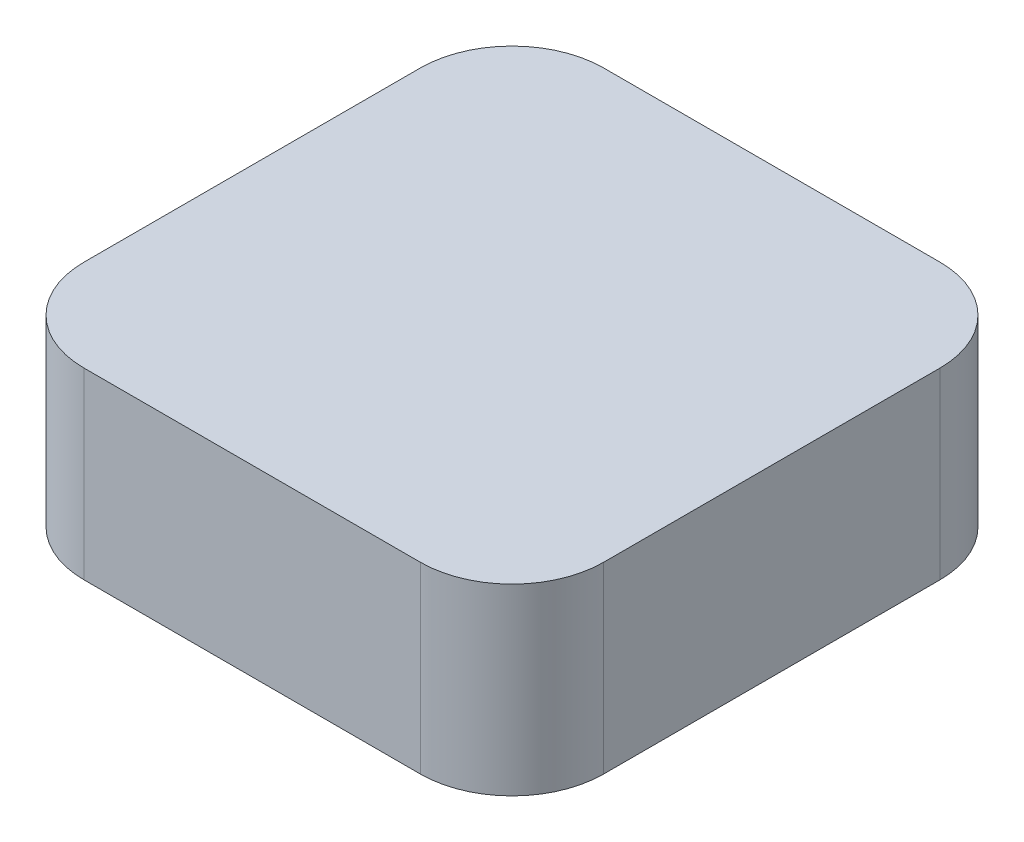
ISO-10303-21;
HEADER;
FILE_DESCRIPTION(('STEP AP214'),'2;1');
FILE_NAME('part.step','',(''),(''),'','','');
FILE_SCHEMA(('AUTOMOTIVE_DESIGN { 1 0 10303 214 1 1 1 1 }'));
ENDSEC;
DATA;
#1=APPLICATION_CONTEXT('core data for automotive mechanical design processes');
#2=APPLICATION_PROTOCOL_DEFINITION('international standard','automotive_design',2000,#1);
#3=PRODUCT_CONTEXT('',#1,'mechanical');
#4=PRODUCT('Part','Part','',(#3));
#5=PRODUCT_RELATED_PRODUCT_CATEGORY('part','',(#4));
#6=PRODUCT_DEFINITION_FORMATION('','',#4);
#7=PRODUCT_DEFINITION_CONTEXT('part definition',#1,'design');
#8=PRODUCT_DEFINITION('design','',#6,#7);
#9=PRODUCT_DEFINITION_SHAPE('','',#8);
#10=(LENGTH_UNIT() NAMED_UNIT(*) SI_UNIT(.MILLI.,.METRE.));
#11=(NAMED_UNIT(*) PLANE_ANGLE_UNIT() SI_UNIT($,.RADIAN.));
#12=(NAMED_UNIT(*) SI_UNIT($,.STERADIAN.) SOLID_ANGLE_UNIT());
#13=UNCERTAINTY_MEASURE_WITH_UNIT(LENGTH_MEASURE(1.E-05),#10,'distance_accuracy_value','');
#14=(GEOMETRIC_REPRESENTATION_CONTEXT(3) GLOBAL_UNCERTAINTY_ASSIGNED_CONTEXT((#13)) GLOBAL_UNIT_ASSIGNED_CONTEXT((#10,
#11,#12)) REPRESENTATION_CONTEXT('',''));
#15=CARTESIAN_POINT('',(0.,0.,0.));
#16=DIRECTION('',(0.,0.,1.));
#17=DIRECTION('',(1.,0.,0.));
#18=AXIS2_PLACEMENT_3D('',#15,#16,#17);
#19=CARTESIAN_POINT('',(-5.5,74.,-87.));
#20=DIRECTION('',(0.,-1.,0.));
#21=DIRECTION('',(0.,0.,-1.));
#22=AXIS2_PLACEMENT_3D('',#19,#20,#21);
#23=PLANE('',#22);
#24=CARTESIAN_POINT('',(-5.5,74.,-87.));
#25=DIRECTION('',(0.,1.,0.));
#26=DIRECTION('',(0.,0.,-1.));
#27=AXIS2_PLACEMENT_3D('',#24,#25,#26);
#28=CIRCLE('',#27,3.);
#29=CARTESIAN_POINT('',(-5.5,74.,-90.));
#30=VERTEX_POINT('',#29);
#31=CARTESIAN_POINT('',(-8.5,74.,-87.));
#32=VERTEX_POINT('',#31);
#33=EDGE_CURVE('E149',#30,#32,#28,.T.);
#34=ORIENTED_EDGE('',*,*,#33,.F.);
#35=DIRECTION('',(-1.,0.,0.));
#36=VECTOR('',#35,1.);
#37=CARTESIAN_POINT('',(-5.5,74.,-90.));
#38=LINE('',#37,#36);
#39=CARTESIAN_POINT('',(5.5,74.,-90.));
#40=VERTEX_POINT('',#39);
#41=EDGE_CURVE('E96',#40,#30,#38,.T.);
#42=ORIENTED_EDGE('',*,*,#41,.F.);
#43=CARTESIAN_POINT('',(5.5,74.,-87.));
#44=DIRECTION('',(0.,1.,0.));
#45=DIRECTION('',(0.,0.,-1.));
#46=AXIS2_PLACEMENT_3D('',#43,#44,#45);
#47=CIRCLE('',#46,3.);
#48=CARTESIAN_POINT('',(8.5,74.,-87.));
#49=VERTEX_POINT('',#48);
#50=EDGE_CURVE('E163',#49,#40,#47,.T.);
#51=ORIENTED_EDGE('',*,*,#50,.F.);
#52=DIRECTION('',(0.,0.,-1.));
#53=VECTOR('',#52,1.);
#54=CARTESIAN_POINT('',(8.5,74.,-87.));
#55=LINE('',#54,#53);
#56=CARTESIAN_POINT('',(8.5,74.,-76.));
#57=VERTEX_POINT('',#56);
#58=EDGE_CURVE('E136',#57,#49,#55,.T.);
#59=ORIENTED_EDGE('',*,*,#58,.F.);
#60=CARTESIAN_POINT('',(5.5,74.,-76.));
#61=DIRECTION('',(0.,1.,0.));
#62=DIRECTION('',(0.,0.,-1.));
#63=AXIS2_PLACEMENT_3D('',#60,#61,#62);
#64=CIRCLE('',#63,3.);
#65=CARTESIAN_POINT('',(5.5,74.,-73.));
#66=VERTEX_POINT('',#65);
#67=EDGE_CURVE('E156',#66,#57,#64,.T.);
#68=ORIENTED_EDGE('',*,*,#67,.F.);
#69=DIRECTION('',(1.,0.,0.));
#70=VECTOR('',#69,1.);
#71=CARTESIAN_POINT('',(5.5,74.,-73.));
#72=LINE('',#71,#70);
#73=CARTESIAN_POINT('',(-5.5,74.,-73.));
#74=VERTEX_POINT('',#73);
#75=EDGE_CURVE('E157',#74,#66,#72,.T.);
#76=ORIENTED_EDGE('',*,*,#75,.F.);
#77=CARTESIAN_POINT('',(-5.5,74.,-76.));
#78=DIRECTION('',(0.,1.,0.));
#79=DIRECTION('',(0.,0.,-1.));
#80=AXIS2_PLACEMENT_3D('',#77,#78,#79);
#81=CIRCLE('',#80,3.);
#82=CARTESIAN_POINT('',(-8.5,74.,-76.));
#83=VERTEX_POINT('',#82);
#84=EDGE_CURVE('E152',#83,#74,#81,.T.);
#85=ORIENTED_EDGE('',*,*,#84,.F.);
#86=DIRECTION('',(0.,0.,1.));
#87=VECTOR('',#86,1.);
#88=CARTESIAN_POINT('',(-8.5,74.,-76.));
#89=LINE('',#88,#87);
#90=EDGE_CURVE('E153',#32,#83,#89,.T.);
#91=ORIENTED_EDGE('',*,*,#90,.F.);
#92=EDGE_LOOP('',(#34,#42,#51,#59,#68,#76,#85,#91));
#93=FACE_BOUND('',#92,.T.);
#94=DIRECTION('',(-1.,0.,0.));
#95=VECTOR('',#94,1.);
#96=CARTESIAN_POINT('',(-5.5,74.,-85.2));
#97=LINE('',#96,#95);
#98=CARTESIAN_POINT('',(3.3,74.,-85.2));
#99=VERTEX_POINT('',#98);
#100=CARTESIAN_POINT('',(-3.3,74.,-85.2));
#101=VERTEX_POINT('',#100);
#102=EDGE_CURVE('E177',#99,#101,#97,.T.);
#103=ORIENTED_EDGE('',*,*,#102,.T.);
#104=CARTESIAN_POINT('',(-3.3,74.,-84.8));
#105=DIRECTION('',(0.,-1.,0.));
#106=DIRECTION('',(0.,0.,-1.));
#107=AXIS2_PLACEMENT_3D('',#104,#105,#106);
#108=CIRCLE('',#107,0.399999999999999);
#109=CARTESIAN_POINT('',(-3.7,74.,-84.8));
#110=VERTEX_POINT('',#109);
#111=EDGE_CURVE('E11',#101,#110,#108,.F.);
#112=ORIENTED_EDGE('',*,*,#111,.T.);
#113=DIRECTION('',(0.,0.,1.));
#114=VECTOR('',#113,1.);
#115=CARTESIAN_POINT('',(-3.7,74.,-87.));
#116=LINE('',#115,#114);
#117=CARTESIAN_POINT('',(-3.7,74.,-78.2));
#118=VERTEX_POINT('',#117);
#119=EDGE_CURVE('E50',#110,#118,#116,.T.);
#120=ORIENTED_EDGE('',*,*,#119,.T.);
#121=CARTESIAN_POINT('',(-3.3,74.,-78.2));
#122=DIRECTION('',(0.,-1.,0.));
#123=DIRECTION('',(0.,0.,-1.));
#124=AXIS2_PLACEMENT_3D('',#121,#122,#123);
#125=CIRCLE('',#124,0.400000000000006);
#126=CARTESIAN_POINT('',(-3.3,74.,-77.8));
#127=VERTEX_POINT('',#126);
#128=EDGE_CURVE('E191',#118,#127,#125,.F.);
#129=ORIENTED_EDGE('',*,*,#128,.T.);
#130=DIRECTION('',(1.,0.,0.));
#131=VECTOR('',#130,1.);
#132=CARTESIAN_POINT('',(-5.5,74.,-77.8));
#133=LINE('',#132,#131);
#134=CARTESIAN_POINT('',(3.3,74.,-77.8));
#135=VERTEX_POINT('',#134);
#136=EDGE_CURVE('E192',#127,#135,#133,.T.);
#137=ORIENTED_EDGE('',*,*,#136,.T.);
#138=CARTESIAN_POINT('',(3.3,74.,-78.2));
#139=DIRECTION('',(0.,-1.,0.));
#140=DIRECTION('',(0.,0.,-1.));
#141=AXIS2_PLACEMENT_3D('',#138,#139,#140);
#142=CIRCLE('',#141,0.400000000000006);
#143=CARTESIAN_POINT('',(3.70000000000001,74.,-78.2));
#144=VERTEX_POINT('',#143);
#145=EDGE_CURVE('E187',#135,#144,#142,.F.);
#146=ORIENTED_EDGE('',*,*,#145,.T.);
#147=DIRECTION('',(0.,0.,-1.));
#148=VECTOR('',#147,1.);
#149=CARTESIAN_POINT('',(3.7,74.,-87.));
#150=LINE('',#149,#148);
#151=CARTESIAN_POINT('',(3.7,74.,-84.8));
#152=VERTEX_POINT('',#151);
#153=EDGE_CURVE('E184',#144,#152,#150,.T.);
#154=ORIENTED_EDGE('',*,*,#153,.T.);
#155=CARTESIAN_POINT('',(3.3,74.,-84.8));
#156=DIRECTION('',(0.,-1.,0.));
#157=DIRECTION('',(0.,0.,-1.));
#158=AXIS2_PLACEMENT_3D('',#155,#156,#157);
#159=CIRCLE('',#158,0.399999999999999);
#160=EDGE_CURVE('E185',#152,#99,#159,.F.);
#161=ORIENTED_EDGE('',*,*,#160,.T.);
#162=EDGE_LOOP('',(#103,#112,#120,#129,#137,#146,#154,#161));
#163=FACE_BOUND('',#162,.T.);
#164=ADVANCED_FACE('F39',(#93,#163),#23,.T.);
#165=CARTESIAN_POINT('',(-5.5,80.,-87.));
#166=DIRECTION('',(0.,-1.,0.));
#167=DIRECTION('',(0.,0.,-1.));
#168=AXIS2_PLACEMENT_3D('',#165,#166,#167);
#169=CYLINDRICAL_SURFACE('',#168,3.);
#170=ORIENTED_EDGE('',*,*,#33,.T.);
#171=DIRECTION('',(0.,-1.,0.));
#172=VECTOR('',#171,1.);
#173=CARTESIAN_POINT('',(-8.5,80.,-87.));
#174=LINE('',#173,#172);
#175=CARTESIAN_POINT('',(-8.5,80.,-87.));
#176=VERTEX_POINT('',#175);
#177=EDGE_CURVE('E180',#176,#32,#174,.T.);
#178=ORIENTED_EDGE('',*,*,#177,.F.);
#179=CARTESIAN_POINT('',(-5.5,80.,-87.));
#180=DIRECTION('',(0.,1.,0.));
#181=DIRECTION('',(0.,0.,-1.));
#182=AXIS2_PLACEMENT_3D('',#179,#180,#181);
#183=CIRCLE('',#182,3.);
#184=CARTESIAN_POINT('',(-5.5,80.,-90.));
#185=VERTEX_POINT('',#184);
#186=EDGE_CURVE('E162',#185,#176,#183,.T.);
#187=ORIENTED_EDGE('',*,*,#186,.F.);
#188=DIRECTION('',(0.,-1.,0.));
#189=VECTOR('',#188,1.);
#190=CARTESIAN_POINT('',(-5.5,80.,-90.));
#191=LINE('',#190,#189);
#192=EDGE_CURVE('E143',#185,#30,#191,.T.);
#193=ORIENTED_EDGE('',*,*,#192,.T.);
#194=EDGE_LOOP('',(#170,#178,#187,#193));
#195=FACE_BOUND('',#194,.T.);
#196=ADVANCED_FACE('F41',(#195),#169,.T.);
#197=CARTESIAN_POINT('',(-8.5,80.,-76.));
#198=DIRECTION('',(1.,0.,0.));
#199=DIRECTION('',(0.,0.,-1.));
#200=AXIS2_PLACEMENT_3D('',#197,#198,#199);
#201=PLANE('',#200);
#202=ORIENTED_EDGE('',*,*,#90,.T.);
#203=DIRECTION('',(0.,-1.,0.));
#204=VECTOR('',#203,1.);
#205=CARTESIAN_POINT('',(-8.5,80.,-76.));
#206=LINE('',#205,#204);
#207=CARTESIAN_POINT('',(-8.5,80.,-76.));
#208=VERTEX_POINT('',#207);
#209=EDGE_CURVE('E174',#208,#83,#206,.T.);
#210=ORIENTED_EDGE('',*,*,#209,.F.);
#211=DIRECTION('',(0.,0.,1.));
#212=VECTOR('',#211,1.);
#213=CARTESIAN_POINT('',(-8.5,80.,-76.));
#214=LINE('',#213,#212);
#215=EDGE_CURVE('E103',#176,#208,#214,.T.);
#216=ORIENTED_EDGE('',*,*,#215,.F.);
#217=ORIENTED_EDGE('',*,*,#177,.T.);
#218=EDGE_LOOP('',(#202,#210,#216,#217));
#219=FACE_BOUND('',#218,.T.);
#220=ADVANCED_FACE('F245',(#219),#201,.F.);
#221=CARTESIAN_POINT('',(-5.5,80.,-76.));
#222=DIRECTION('',(0.,-1.,0.));
#223=DIRECTION('',(0.,0.,-1.));
#224=AXIS2_PLACEMENT_3D('',#221,#222,#223);
#225=CYLINDRICAL_SURFACE('',#224,3.);
#226=ORIENTED_EDGE('',*,*,#84,.T.);
#227=DIRECTION('',(0.,-1.,0.));
#228=VECTOR('',#227,1.);
#229=CARTESIAN_POINT('',(-5.5,80.,-73.));
#230=LINE('',#229,#228);
#231=CARTESIAN_POINT('',(-5.5,80.,-73.));
#232=VERTEX_POINT('',#231);
#233=EDGE_CURVE('E173',#232,#74,#230,.T.);
#234=ORIENTED_EDGE('',*,*,#233,.F.);
#235=CARTESIAN_POINT('',(-5.5,80.,-76.));
#236=DIRECTION('',(0.,1.,0.));
#237=DIRECTION('',(0.,0.,-1.));
#238=AXIS2_PLACEMENT_3D('',#235,#236,#237);
#239=CIRCLE('',#238,3.);
#240=EDGE_CURVE('E223',#208,#232,#239,.T.);
#241=ORIENTED_EDGE('',*,*,#240,.F.);
#242=ORIENTED_EDGE('',*,*,#209,.T.);
#243=EDGE_LOOP('',(#226,#234,#241,#242));
#244=FACE_BOUND('',#243,.T.);
#245=ADVANCED_FACE('F244',(#244),#225,.T.);
#246=CARTESIAN_POINT('',(5.5,80.,-73.));
#247=DIRECTION('',(0.,0.,-1.));
#248=DIRECTION('',(-1.,0.,0.));
#249=AXIS2_PLACEMENT_3D('',#246,#247,#248);
#250=PLANE('',#249);
#251=ORIENTED_EDGE('',*,*,#75,.T.);
#252=DIRECTION('',(0.,-1.,0.));
#253=VECTOR('',#252,1.);
#254=CARTESIAN_POINT('',(5.5,80.,-73.));
#255=LINE('',#254,#253);
#256=CARTESIAN_POINT('',(5.5,80.,-73.));
#257=VERTEX_POINT('',#256);
#258=EDGE_CURVE('E166',#257,#66,#255,.T.);
#259=ORIENTED_EDGE('',*,*,#258,.F.);
#260=DIRECTION('',(1.,0.,0.));
#261=VECTOR('',#260,1.);
#262=CARTESIAN_POINT('',(5.5,80.,-73.));
#263=LINE('',#262,#261);
#264=EDGE_CURVE('E224',#232,#257,#263,.T.);
#265=ORIENTED_EDGE('',*,*,#264,.F.);
#266=ORIENTED_EDGE('',*,*,#233,.T.);
#267=EDGE_LOOP('',(#251,#259,#265,#266));
#268=FACE_BOUND('',#267,.T.);
#269=ADVANCED_FACE('F231',(#268),#250,.F.);
#270=CARTESIAN_POINT('',(5.5,80.,-76.));
#271=DIRECTION('',(0.,-1.,0.));
#272=DIRECTION('',(0.,0.,-1.));
#273=AXIS2_PLACEMENT_3D('',#270,#271,#272);
#274=CYLINDRICAL_SURFACE('',#273,3.);
#275=ORIENTED_EDGE('',*,*,#67,.T.);
#276=DIRECTION('',(0.,-1.,0.));
#277=VECTOR('',#276,1.);
#278=CARTESIAN_POINT('',(8.5,80.,-76.));
#279=LINE('',#278,#277);
#280=CARTESIAN_POINT('',(8.5,80.,-76.));
#281=VERTEX_POINT('',#280);
#282=EDGE_CURVE('E137',#281,#57,#279,.T.);
#283=ORIENTED_EDGE('',*,*,#282,.F.);
#284=CARTESIAN_POINT('',(5.5,80.,-76.));
#285=DIRECTION('',(0.,1.,0.));
#286=DIRECTION('',(0.,0.,-1.));
#287=AXIS2_PLACEMENT_3D('',#284,#285,#286);
#288=CIRCLE('',#287,3.);
#289=EDGE_CURVE('E130',#257,#281,#288,.T.);
#290=ORIENTED_EDGE('',*,*,#289,.F.);
#291=ORIENTED_EDGE('',*,*,#258,.T.);
#292=EDGE_LOOP('',(#275,#283,#290,#291));
#293=FACE_BOUND('',#292,.T.);
#294=ADVANCED_FACE('F234',(#293),#274,.T.);
#295=CARTESIAN_POINT('',(8.5,80.,-87.));
#296=DIRECTION('',(-1.,0.,0.));
#297=DIRECTION('',(0.,0.,1.));
#298=AXIS2_PLACEMENT_3D('',#295,#296,#297);
#299=PLANE('',#298);
#300=ORIENTED_EDGE('',*,*,#58,.T.);
#301=DIRECTION('',(0.,-1.,0.));
#302=VECTOR('',#301,1.);
#303=CARTESIAN_POINT('',(8.5,80.,-87.));
#304=LINE('',#303,#302);
#305=CARTESIAN_POINT('',(8.5,80.,-87.));
#306=VERTEX_POINT('',#305);
#307=EDGE_CURVE('E133',#306,#49,#304,.T.);
#308=ORIENTED_EDGE('',*,*,#307,.F.);
#309=DIRECTION('',(0.,0.,-1.));
#310=VECTOR('',#309,1.);
#311=CARTESIAN_POINT('',(8.5,80.,-87.));
#312=LINE('',#311,#310);
#313=EDGE_CURVE('E119',#281,#306,#312,.T.);
#314=ORIENTED_EDGE('',*,*,#313,.F.);
#315=ORIENTED_EDGE('',*,*,#282,.T.);
#316=EDGE_LOOP('',(#300,#308,#314,#315));
#317=FACE_BOUND('',#316,.T.);
#318=ADVANCED_FACE('F132',(#317),#299,.F.);
#319=CARTESIAN_POINT('',(5.5,80.,-87.));
#320=DIRECTION('',(0.,-1.,0.));
#321=DIRECTION('',(0.,0.,-1.));
#322=AXIS2_PLACEMENT_3D('',#319,#320,#321);
#323=CYLINDRICAL_SURFACE('',#322,3.);
#324=ORIENTED_EDGE('',*,*,#50,.T.);
#325=DIRECTION('',(0.,-1.,0.));
#326=VECTOR('',#325,1.);
#327=CARTESIAN_POINT('',(5.5,80.,-90.));
#328=LINE('',#327,#326);
#329=CARTESIAN_POINT('',(5.5,80.,-90.));
#330=VERTEX_POINT('',#329);
#331=EDGE_CURVE('E139',#330,#40,#328,.T.);
#332=ORIENTED_EDGE('',*,*,#331,.F.);
#333=CARTESIAN_POINT('',(5.5,80.,-87.));
#334=DIRECTION('',(0.,1.,0.));
#335=DIRECTION('',(0.,0.,-1.));
#336=AXIS2_PLACEMENT_3D('',#333,#334,#335);
#337=CIRCLE('',#336,3.);
#338=EDGE_CURVE('E125',#306,#330,#337,.T.);
#339=ORIENTED_EDGE('',*,*,#338,.F.);
#340=ORIENTED_EDGE('',*,*,#307,.T.);
#341=EDGE_LOOP('',(#324,#332,#339,#340));
#342=FACE_BOUND('',#341,.T.);
#343=ADVANCED_FACE('F145',(#342),#323,.T.);
#344=CARTESIAN_POINT('',(-5.5,80.,-90.));
#345=DIRECTION('',(0.,0.,1.));
#346=DIRECTION('',(1.,0.,0.));
#347=AXIS2_PLACEMENT_3D('',#344,#345,#346);
#348=PLANE('',#347);
#349=ORIENTED_EDGE('',*,*,#41,.T.);
#350=ORIENTED_EDGE('',*,*,#192,.F.);
#351=DIRECTION('',(-1.,0.,0.));
#352=VECTOR('',#351,1.);
#353=CARTESIAN_POINT('',(-5.5,80.,-90.));
#354=LINE('',#353,#352);
#355=EDGE_CURVE('E61',#330,#185,#354,.T.);
#356=ORIENTED_EDGE('',*,*,#355,.F.);
#357=ORIENTED_EDGE('',*,*,#331,.T.);
#358=EDGE_LOOP('',(#349,#350,#356,#357));
#359=FACE_BOUND('',#358,.T.);
#360=ADVANCED_FACE('F239',(#359),#348,.F.);
#361=CARTESIAN_POINT('',(-5.5,80.,-87.));
#362=DIRECTION('',(0.,-1.,0.));
#363=DIRECTION('',(0.,0.,-1.));
#364=AXIS2_PLACEMENT_3D('',#361,#362,#363);
#365=PLANE('',#364);
#366=ORIENTED_EDGE('',*,*,#186,.T.);
#367=ORIENTED_EDGE('',*,*,#215,.T.);
#368=ORIENTED_EDGE('',*,*,#240,.T.);
#369=ORIENTED_EDGE('',*,*,#264,.T.);
#370=ORIENTED_EDGE('',*,*,#289,.T.);
#371=ORIENTED_EDGE('',*,*,#313,.T.);
#372=ORIENTED_EDGE('',*,*,#338,.T.);
#373=ORIENTED_EDGE('',*,*,#355,.T.);
#374=EDGE_LOOP('',(#366,#367,#368,#369,#370,#371,#372,#373));
#375=FACE_BOUND('',#374,.T.);
#376=ADVANCED_FACE('F122',(#375),#365,.F.);
#377=CARTESIAN_POINT('',(-3.3,77.,-84.8));
#378=DIRECTION('',(0.,-1.,0.));
#379=DIRECTION('',(0.,0.,-1.));
#380=AXIS2_PLACEMENT_3D('',#377,#378,#379);
#381=CYLINDRICAL_SURFACE('',#380,0.399999999999999);
#382=DIRECTION('',(0.,-1.,0.));
#383=VECTOR('',#382,1.);
#384=CARTESIAN_POINT('',(-3.3,77.,-85.2));
#385=LINE('',#384,#383);
#386=CARTESIAN_POINT('',(-3.3,77.,-85.2));
#387=VERTEX_POINT('',#386);
#388=EDGE_CURVE('E53',#387,#101,#385,.T.);
#389=ORIENTED_EDGE('',*,*,#388,.F.);
#390=CARTESIAN_POINT('',(-3.3,77.,-84.8));
#391=DIRECTION('',(0.,1.,0.));
#392=DIRECTION('',(0.,0.,-1.));
#393=AXIS2_PLACEMENT_3D('',#390,#391,#392);
#394=CIRCLE('',#393,0.399999999999999);
#395=CARTESIAN_POINT('',(-3.7,77.,-84.8));
#396=VERTEX_POINT('',#395);
#397=EDGE_CURVE('E214',#387,#396,#394,.T.);
#398=ORIENTED_EDGE('',*,*,#397,.T.);
#399=DIRECTION('',(0.,-1.,0.));
#400=VECTOR('',#399,1.);
#401=CARTESIAN_POINT('',(-3.7,77.,-84.8));
#402=LINE('',#401,#400);
#403=EDGE_CURVE('E155',#396,#110,#402,.T.);
#404=ORIENTED_EDGE('',*,*,#403,.T.);
#405=ORIENTED_EDGE('',*,*,#111,.F.);
#406=EDGE_LOOP('',(#389,#398,#404,#405));
#407=FACE_BOUND('',#406,.T.);
#408=ADVANCED_FACE('F211',(#407),#381,.F.);
#409=CARTESIAN_POINT('',(-3.7,77.,-78.2));
#410=DIRECTION('',(1.,0.,0.));
#411=DIRECTION('',(0.,0.,-1.));
#412=AXIS2_PLACEMENT_3D('',#409,#410,#411);
#413=PLANE('',#412);
#414=ORIENTED_EDGE('',*,*,#403,.F.);
#415=DIRECTION('',(0.,0.,1.));
#416=VECTOR('',#415,1.);
#417=CARTESIAN_POINT('',(-3.7,77.,-78.2));
#418=LINE('',#417,#416);
#419=CARTESIAN_POINT('',(-3.7,77.,-78.2));
#420=VERTEX_POINT('',#419);
#421=EDGE_CURVE('E392',#396,#420,#418,.T.);
#422=ORIENTED_EDGE('',*,*,#421,.T.);
#423=DIRECTION('',(0.,-1.,0.));
#424=VECTOR('',#423,1.);
#425=CARTESIAN_POINT('',(-3.7,77.,-78.2));
#426=LINE('',#425,#424);
#427=EDGE_CURVE('E209',#420,#118,#426,.T.);
#428=ORIENTED_EDGE('',*,*,#427,.T.);
#429=ORIENTED_EDGE('',*,*,#119,.F.);
#430=EDGE_LOOP('',(#414,#422,#428,#429));
#431=FACE_BOUND('',#430,.T.);
#432=ADVANCED_FACE('F208',(#431),#413,.T.);
#433=CARTESIAN_POINT('',(-3.3,77.,-78.2));
#434=DIRECTION('',(0.,-1.,0.));
#435=DIRECTION('',(0.,0.,-1.));
#436=AXIS2_PLACEMENT_3D('',#433,#434,#435);
#437=CYLINDRICAL_SURFACE('',#436,0.400000000000006);
#438=ORIENTED_EDGE('',*,*,#427,.F.);
#439=CARTESIAN_POINT('',(-3.3,77.,-78.2));
#440=DIRECTION('',(0.,1.,0.));
#441=DIRECTION('',(0.,0.,-1.));
#442=AXIS2_PLACEMENT_3D('',#439,#440,#441);
#443=CIRCLE('',#442,0.400000000000006);
#444=CARTESIAN_POINT('',(-3.3,77.,-77.8));
#445=VERTEX_POINT('',#444);
#446=EDGE_CURVE('E398',#420,#445,#443,.T.);
#447=ORIENTED_EDGE('',*,*,#446,.T.);
#448=DIRECTION('',(0.,-1.,0.));
#449=VECTOR('',#448,1.);
#450=CARTESIAN_POINT('',(-3.3,77.,-77.8));
#451=LINE('',#450,#449);
#452=EDGE_CURVE('E220',#445,#127,#451,.T.);
#453=ORIENTED_EDGE('',*,*,#452,.T.);
#454=ORIENTED_EDGE('',*,*,#128,.F.);
#455=EDGE_LOOP('',(#438,#447,#453,#454));
#456=FACE_BOUND('',#455,.T.);
#457=ADVANCED_FACE('F312',(#456),#437,.F.);
#458=CARTESIAN_POINT('',(3.3,77.,-77.8));
#459=DIRECTION('',(0.,0.,-1.));
#460=DIRECTION('',(-1.,0.,0.));
#461=AXIS2_PLACEMENT_3D('',#458,#459,#460);
#462=PLANE('',#461);
#463=ORIENTED_EDGE('',*,*,#452,.F.);
#464=DIRECTION('',(1.,0.,0.));
#465=VECTOR('',#464,1.);
#466=CARTESIAN_POINT('',(3.3,77.,-77.8));
#467=LINE('',#466,#465);
#468=CARTESIAN_POINT('',(3.3,77.,-77.8));
#469=VERTEX_POINT('',#468);
#470=EDGE_CURVE('E401',#445,#469,#467,.T.);
#471=ORIENTED_EDGE('',*,*,#470,.T.);
#472=DIRECTION('',(0.,-1.,0.));
#473=VECTOR('',#472,1.);
#474=CARTESIAN_POINT('',(3.3,77.,-77.8));
#475=LINE('',#474,#473);
#476=EDGE_CURVE('E422',#469,#135,#475,.T.);
#477=ORIENTED_EDGE('',*,*,#476,.T.);
#478=ORIENTED_EDGE('',*,*,#136,.F.);
#479=EDGE_LOOP('',(#463,#471,#477,#478));
#480=FACE_BOUND('',#479,.T.);
#481=ADVANCED_FACE('F322',(#480),#462,.T.);
#482=CARTESIAN_POINT('',(3.3,77.,-78.2));
#483=DIRECTION('',(0.,-1.,0.));
#484=DIRECTION('',(0.,0.,-1.));
#485=AXIS2_PLACEMENT_3D('',#482,#483,#484);
#486=CYLINDRICAL_SURFACE('',#485,0.400000000000006);
#487=ORIENTED_EDGE('',*,*,#476,.F.);
#488=CARTESIAN_POINT('',(3.3,77.,-78.2));
#489=DIRECTION('',(0.,1.,0.));
#490=DIRECTION('',(0.,0.,-1.));
#491=AXIS2_PLACEMENT_3D('',#488,#489,#490);
#492=CIRCLE('',#491,0.400000000000006);
#493=CARTESIAN_POINT('',(3.70000000000001,77.,-78.2));
#494=VERTEX_POINT('',#493);
#495=EDGE_CURVE('E402',#469,#494,#492,.T.);
#496=ORIENTED_EDGE('',*,*,#495,.T.);
#497=DIRECTION('',(0.,-1.,0.));
#498=VECTOR('',#497,1.);
#499=CARTESIAN_POINT('',(3.70000000000001,77.,-78.2));
#500=LINE('',#499,#498);
#501=EDGE_CURVE('E423',#494,#144,#500,.T.);
#502=ORIENTED_EDGE('',*,*,#501,.T.);
#503=ORIENTED_EDGE('',*,*,#145,.F.);
#504=EDGE_LOOP('',(#487,#496,#502,#503));
#505=FACE_BOUND('',#504,.T.);
#506=ADVANCED_FACE('F331',(#505),#486,.F.);
#507=CARTESIAN_POINT('',(3.7,77.,-84.8));
#508=DIRECTION('',(-1.,0.,0.));
#509=DIRECTION('',(0.,0.,1.));
#510=AXIS2_PLACEMENT_3D('',#507,#508,#509);
#511=PLANE('',#510);
#512=ORIENTED_EDGE('',*,*,#501,.F.);
#513=DIRECTION('',(0.,0.,-1.));
#514=VECTOR('',#513,1.);
#515=CARTESIAN_POINT('',(3.7,77.,-84.8));
#516=LINE('',#515,#514);
#517=CARTESIAN_POINT('',(3.7,77.,-84.8));
#518=VERTEX_POINT('',#517);
#519=EDGE_CURVE('E410',#494,#518,#516,.T.);
#520=ORIENTED_EDGE('',*,*,#519,.T.);
#521=DIRECTION('',(0.,-1.,0.));
#522=VECTOR('',#521,1.);
#523=CARTESIAN_POINT('',(3.7,77.,-84.8));
#524=LINE('',#523,#522);
#525=EDGE_CURVE('E419',#518,#152,#524,.T.);
#526=ORIENTED_EDGE('',*,*,#525,.T.);
#527=ORIENTED_EDGE('',*,*,#153,.F.);
#528=EDGE_LOOP('',(#512,#520,#526,#527));
#529=FACE_BOUND('',#528,.T.);
#530=ADVANCED_FACE('F341',(#529),#511,.T.);
#531=CARTESIAN_POINT('',(3.3,77.,-84.8));
#532=DIRECTION('',(0.,-1.,0.));
#533=DIRECTION('',(0.,0.,-1.));
#534=AXIS2_PLACEMENT_3D('',#531,#532,#533);
#535=CYLINDRICAL_SURFACE('',#534,0.399999999999999);
#536=ORIENTED_EDGE('',*,*,#525,.F.);
#537=CARTESIAN_POINT('',(3.3,77.,-84.8));
#538=DIRECTION('',(0.,1.,0.));
#539=DIRECTION('',(0.,0.,-1.));
#540=AXIS2_PLACEMENT_3D('',#537,#538,#539);
#541=CIRCLE('',#540,0.399999999999999);
#542=CARTESIAN_POINT('',(3.3,77.,-85.2));
#543=VERTEX_POINT('',#542);
#544=EDGE_CURVE('E409',#518,#543,#541,.T.);
#545=ORIENTED_EDGE('',*,*,#544,.T.);
#546=DIRECTION('',(0.,-1.,0.));
#547=VECTOR('',#546,1.);
#548=CARTESIAN_POINT('',(3.3,77.,-85.2));
#549=LINE('',#548,#547);
#550=EDGE_CURVE('E414',#543,#99,#549,.T.);
#551=ORIENTED_EDGE('',*,*,#550,.T.);
#552=ORIENTED_EDGE('',*,*,#160,.F.);
#553=EDGE_LOOP('',(#536,#545,#551,#552));
#554=FACE_BOUND('',#553,.T.);
#555=ADVANCED_FACE('F351',(#554),#535,.F.);
#556=CARTESIAN_POINT('',(-3.3,77.,-85.2));
#557=DIRECTION('',(0.,0.,1.));
#558=DIRECTION('',(1.,0.,0.));
#559=AXIS2_PLACEMENT_3D('',#556,#557,#558);
#560=PLANE('',#559);
#561=ORIENTED_EDGE('',*,*,#550,.F.);
#562=DIRECTION('',(-1.,0.,0.));
#563=VECTOR('',#562,1.);
#564=CARTESIAN_POINT('',(-3.3,77.,-85.2));
#565=LINE('',#564,#563);
#566=EDGE_CURVE('E389',#543,#387,#565,.T.);
#567=ORIENTED_EDGE('',*,*,#566,.T.);
#568=ORIENTED_EDGE('',*,*,#388,.T.);
#569=ORIENTED_EDGE('',*,*,#102,.F.);
#570=EDGE_LOOP('',(#561,#567,#568,#569));
#571=FACE_BOUND('',#570,.T.);
#572=ADVANCED_FACE('F363',(#571),#560,.T.);
#573=CARTESIAN_POINT('',(-3.3,77.,-84.8));
#574=DIRECTION('',(0.,-1.,0.));
#575=DIRECTION('',(0.,0.,-1.));
#576=AXIS2_PLACEMENT_3D('',#573,#574,#575);
#577=PLANE('',#576);
#578=ORIENTED_EDGE('',*,*,#397,.F.);
#579=ORIENTED_EDGE('',*,*,#566,.F.);
#580=ORIENTED_EDGE('',*,*,#544,.F.);
#581=ORIENTED_EDGE('',*,*,#519,.F.);
#582=ORIENTED_EDGE('',*,*,#495,.F.);
#583=ORIENTED_EDGE('',*,*,#470,.F.);
#584=ORIENTED_EDGE('',*,*,#446,.F.);
#585=ORIENTED_EDGE('',*,*,#421,.F.);
#586=EDGE_LOOP('',(#578,#579,#580,#581,#582,#583,#584,#585));
#587=FACE_BOUND('',#586,.T.);
#588=ADVANCED_FACE('F374',(#587),#577,.T.);
#589=CLOSED_SHELL('',(#164,#196,#220,#245,#269,#294,#318,#343,#360,#376,#408,#432,#457,#481,
#506,#530,#555,#572,#588));
#590=MANIFOLD_SOLID_BREP('B2',#589);
#591=ADVANCED_BREP_SHAPE_REPRESENTATION('',(#18,#590),#14);
#592=SHAPE_DEFINITION_REPRESENTATION(#9,#591);
ENDSEC;
END-ISO-10303-21;
